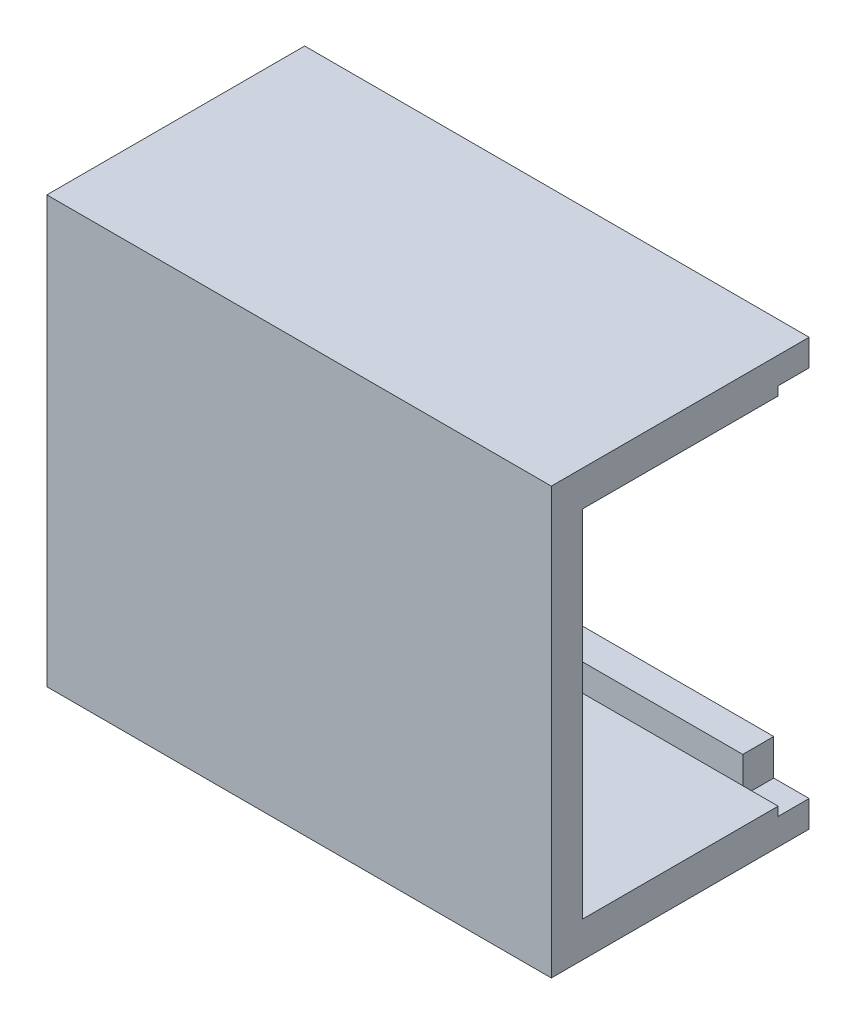
ISO-10303-21;
HEADER;
FILE_DESCRIPTION(('STEP AP214'),'2;1');
FILE_NAME('part.step','',(''),(''),'','','');
FILE_SCHEMA(('AUTOMOTIVE_DESIGN { 1 0 10303 214 1 1 1 1 }'));
ENDSEC;
DATA;
#1=APPLICATION_CONTEXT('core data for automotive mechanical design processes');
#2=APPLICATION_PROTOCOL_DEFINITION('international standard','automotive_design',2000,#1);
#3=PRODUCT_CONTEXT('',#1,'mechanical');
#4=PRODUCT('Part','Part','',(#3));
#5=PRODUCT_RELATED_PRODUCT_CATEGORY('part','',(#4));
#6=PRODUCT_DEFINITION_FORMATION('','',#4);
#7=PRODUCT_DEFINITION_CONTEXT('part definition',#1,'design');
#8=PRODUCT_DEFINITION('design','',#6,#7);
#9=PRODUCT_DEFINITION_SHAPE('','',#8);
#10=(LENGTH_UNIT() NAMED_UNIT(*) SI_UNIT(.MILLI.,.METRE.));
#11=(NAMED_UNIT(*) PLANE_ANGLE_UNIT() SI_UNIT($,.RADIAN.));
#12=(NAMED_UNIT(*) SI_UNIT($,.STERADIAN.) SOLID_ANGLE_UNIT());
#13=UNCERTAINTY_MEASURE_WITH_UNIT(LENGTH_MEASURE(1.E-05),#10,'distance_accuracy_value','');
#14=(GEOMETRIC_REPRESENTATION_CONTEXT(3) GLOBAL_UNCERTAINTY_ASSIGNED_CONTEXT((#13)) GLOBAL_UNIT_ASSIGNED_CONTEXT((#10,
#11,#12)) REPRESENTATION_CONTEXT('',''));
#15=CARTESIAN_POINT('',(0.,0.,0.));
#16=DIRECTION('',(0.,0.,1.));
#17=DIRECTION('',(1.,0.,0.));
#18=AXIS2_PLACEMENT_3D('',#15,#16,#17);
#19=CARTESIAN_POINT('',(0.,0.,0.));
#20=DIRECTION('',(0.,0.,-1.));
#21=DIRECTION('',(-1.,0.,0.));
#22=AXIS2_PLACEMENT_3D('',#19,#20,#21);
#23=PLANE('',#22);
#24=DIRECTION('',(1.,0.,0.));
#25=VECTOR('',#24,1.);
#26=CARTESIAN_POINT('',(12.25,10.5332,0.));
#27=LINE('',#26,#25);
#28=CARTESIAN_POINT('',(12.25,10.5332,0.));
#29=VERTEX_POINT('',#28);
#30=CARTESIAN_POINT('',(14.25,10.5332,0.));
#31=VERTEX_POINT('',#30);
#32=EDGE_CURVE('E207',#29,#31,#27,.T.);
#33=ORIENTED_EDGE('',*,*,#32,.F.);
#34=DIRECTION('',(0.,1.,0.));
#35=VECTOR('',#34,1.);
#36=CARTESIAN_POINT('',(12.25,10.5332,0.));
#37=LINE('',#36,#35);
#38=CARTESIAN_POINT('',(12.25,8.5,0.));
#39=VERTEX_POINT('',#38);
#40=EDGE_CURVE('E224',#39,#29,#37,.T.);
#41=ORIENTED_EDGE('',*,*,#40,.F.);
#42=DIRECTION('',(1.,0.,0.));
#43=VECTOR('',#42,1.);
#44=CARTESIAN_POINT('',(-14.25,8.5,0.));
#45=LINE('',#44,#43);
#46=CARTESIAN_POINT('',(-14.25,8.5,0.));
#47=VERTEX_POINT('',#46);
#48=EDGE_CURVE('E292',#47,#39,#45,.T.);
#49=ORIENTED_EDGE('',*,*,#48,.F.);
#50=DIRECTION('',(0.,1.,0.));
#51=VECTOR('',#50,1.);
#52=CARTESIAN_POINT('',(-14.25,-12.0332,0.));
#53=LINE('',#52,#51);
#54=CARTESIAN_POINT('',(-14.25,12.0332,0.));
#55=VERTEX_POINT('',#54);
#56=EDGE_CURVE('E326',#47,#55,#53,.T.);
#57=ORIENTED_EDGE('',*,*,#56,.T.);
#58=DIRECTION('',(-1.,0.,0.));
#59=VECTOR('',#58,1.);
#60=CARTESIAN_POINT('',(14.25,12.0332,0.));
#61=LINE('',#60,#59);
#62=CARTESIAN_POINT('',(14.25,12.0332,0.));
#63=VERTEX_POINT('',#62);
#64=EDGE_CURVE('E331',#63,#55,#61,.T.);
#65=ORIENTED_EDGE('',*,*,#64,.F.);
#66=DIRECTION('',(0.,1.,0.));
#67=VECTOR('',#66,1.);
#68=CARTESIAN_POINT('',(14.25,-12.0332,0.));
#69=LINE('',#68,#67);
#70=EDGE_CURVE('E335',#31,#63,#69,.T.);
#71=ORIENTED_EDGE('',*,*,#70,.F.);
#72=EDGE_LOOP('',(#33,#41,#49,#57,#65,#71));
#73=FACE_BOUND('',#72,.T.);
#74=ADVANCED_FACE('F45',(#73),#23,.T.);
#75=CARTESIAN_POINT('',(14.25,-12.0332,14.5651));
#76=DIRECTION('',(0.,-1.,0.));
#77=DIRECTION('',(0.,0.,-1.));
#78=AXIS2_PLACEMENT_3D('',#75,#76,#77);
#79=PLANE('',#78);
#80=DIRECTION('',(-1.,0.,0.));
#81=VECTOR('',#80,1.);
#82=CARTESIAN_POINT('',(14.25,-12.0332,0.));
#83=LINE('',#82,#81);
#84=CARTESIAN_POINT('',(14.25,-12.0332,0.));
#85=VERTEX_POINT('',#84);
#86=CARTESIAN_POINT('',(-14.25,-12.0332,0.));
#87=VERTEX_POINT('',#86);
#88=EDGE_CURVE('E280',#85,#87,#83,.T.);
#89=ORIENTED_EDGE('',*,*,#88,.F.);
#90=DIRECTION('',(0.,0.,-1.));
#91=VECTOR('',#90,1.);
#92=CARTESIAN_POINT('',(14.25,-12.0332,14.5651));
#93=LINE('',#92,#91);
#94=CARTESIAN_POINT('',(14.25,-12.0332,14.5651));
#95=VERTEX_POINT('',#94);
#96=EDGE_CURVE('E11',#95,#85,#93,.T.);
#97=ORIENTED_EDGE('',*,*,#96,.F.);
#98=DIRECTION('',(-1.,0.,0.));
#99=VECTOR('',#98,1.);
#100=CARTESIAN_POINT('',(14.25,-12.0332,14.5651));
#101=LINE('',#100,#99);
#102=CARTESIAN_POINT('',(-14.25,-12.0332,14.5651));
#103=VERTEX_POINT('',#102);
#104=EDGE_CURVE('E308',#95,#103,#101,.T.);
#105=ORIENTED_EDGE('',*,*,#104,.T.);
#106=DIRECTION('',(0.,0.,-1.));
#107=VECTOR('',#106,1.);
#108=CARTESIAN_POINT('',(-14.25,-12.0332,14.5651));
#109=LINE('',#108,#107);
#110=EDGE_CURVE('E49',#103,#87,#109,.T.);
#111=ORIENTED_EDGE('',*,*,#110,.T.);
#112=EDGE_LOOP('',(#89,#97,#105,#111));
#113=FACE_BOUND('',#112,.T.);
#114=ADVANCED_FACE('F47',(#113),#79,.T.);
#115=CARTESIAN_POINT('',(14.25,-12.0332,14.5651));
#116=DIRECTION('',(-1.,0.,0.));
#117=DIRECTION('',(0.,0.,1.));
#118=AXIS2_PLACEMENT_3D('',#115,#116,#117);
#119=PLANE('',#118);
#120=CARTESIAN_POINT('',(14.25,-10.5332,0.));
#121=VERTEX_POINT('',#120);
#122=EDGE_CURVE('E313',#85,#121,#69,.T.);
#123=ORIENTED_EDGE('',*,*,#122,.T.);
#124=DIRECTION('',(0.,0.,-1.));
#125=VECTOR('',#124,1.);
#126=CARTESIAN_POINT('',(14.25,-10.5332,0.));
#127=LINE('',#126,#125);
#128=CARTESIAN_POINT('',(14.25,-10.5332,1.75));
#129=VERTEX_POINT('',#128);
#130=EDGE_CURVE('E176',#129,#121,#127,.T.);
#131=ORIENTED_EDGE('',*,*,#130,.F.);
#132=DIRECTION('',(0.,-1.,0.));
#133=VECTOR('',#132,1.);
#134=CARTESIAN_POINT('',(14.25,-10.5332,1.75));
#135=LINE('',#134,#133);
#136=CARTESIAN_POINT('',(14.25,-10.0332,1.75));
#137=VERTEX_POINT('',#136);
#138=EDGE_CURVE('E182',#137,#129,#135,.T.);
#139=ORIENTED_EDGE('',*,*,#138,.F.);
#140=DIRECTION('',(0.,0.,-1.));
#141=VECTOR('',#140,1.);
#142=CARTESIAN_POINT('',(14.25,-10.0332,12.8151));
#143=LINE('',#142,#141);
#144=CARTESIAN_POINT('',(14.25,-10.0332,12.8151));
#145=VERTEX_POINT('',#144);
#146=EDGE_CURVE('E236',#145,#137,#143,.T.);
#147=ORIENTED_EDGE('',*,*,#146,.F.);
#148=DIRECTION('',(0.,-1.,0.));
#149=VECTOR('',#148,1.);
#150=CARTESIAN_POINT('',(14.25,-10.0332,12.8151));
#151=LINE('',#150,#149);
#152=CARTESIAN_POINT('',(14.25,10.0332,12.8151));
#153=VERTEX_POINT('',#152);
#154=EDGE_CURVE('E242',#153,#145,#151,.T.);
#155=ORIENTED_EDGE('',*,*,#154,.F.);
#156=DIRECTION('',(0.,0.,1.));
#157=VECTOR('',#156,1.);
#158=CARTESIAN_POINT('',(14.25,10.0332,12.8151));
#159=LINE('',#158,#157);
#160=CARTESIAN_POINT('',(14.25,10.0332,1.75));
#161=VERTEX_POINT('',#160);
#162=EDGE_CURVE('E270',#161,#153,#159,.T.);
#163=ORIENTED_EDGE('',*,*,#162,.F.);
#164=DIRECTION('',(0.,-1.,0.));
#165=VECTOR('',#164,1.);
#166=CARTESIAN_POINT('',(14.25,10.0332,1.75));
#167=LINE('',#166,#165);
#168=CARTESIAN_POINT('',(14.25,10.5332,1.75));
#169=VERTEX_POINT('',#168);
#170=EDGE_CURVE('E214',#169,#161,#167,.T.);
#171=ORIENTED_EDGE('',*,*,#170,.F.);
#172=DIRECTION('',(0.,0.,1.));
#173=VECTOR('',#172,1.);
#174=CARTESIAN_POINT('',(14.25,10.5332,1.75));
#175=LINE('',#174,#173);
#176=EDGE_CURVE('E201',#31,#169,#175,.T.);
#177=ORIENTED_EDGE('',*,*,#176,.F.);
#178=ORIENTED_EDGE('',*,*,#70,.T.);
#179=DIRECTION('',(0.,0.,-1.));
#180=VECTOR('',#179,1.);
#181=CARTESIAN_POINT('',(14.25,12.0332,14.5651));
#182=LINE('',#181,#180);
#183=CARTESIAN_POINT('',(14.25,12.0332,14.5651));
#184=VERTEX_POINT('',#183);
#185=EDGE_CURVE('E55',#184,#63,#182,.T.);
#186=ORIENTED_EDGE('',*,*,#185,.F.);
#187=DIRECTION('',(0.,1.,0.));
#188=VECTOR('',#187,1.);
#189=CARTESIAN_POINT('',(14.25,-12.0332,14.5651));
#190=LINE('',#189,#188);
#191=EDGE_CURVE('E320',#95,#184,#190,.T.);
#192=ORIENTED_EDGE('',*,*,#191,.F.);
#193=ORIENTED_EDGE('',*,*,#96,.T.);
#194=EDGE_LOOP('',(#123,#131,#139,#147,#155,#163,#171,#177,#178,#186,#192,#193));
#195=FACE_BOUND('',#194,.T.);
#196=ADVANCED_FACE('F359',(#195),#119,.F.);
#197=CARTESIAN_POINT('',(14.25,12.0332,14.5651));
#198=DIRECTION('',(0.,-1.,0.));
#199=DIRECTION('',(0.,0.,-1.));
#200=AXIS2_PLACEMENT_3D('',#197,#198,#199);
#201=PLANE('',#200);
#202=ORIENTED_EDGE('',*,*,#64,.T.);
#203=DIRECTION('',(0.,0.,-1.));
#204=VECTOR('',#203,1.);
#205=CARTESIAN_POINT('',(-14.25,12.0332,14.5651));
#206=LINE('',#205,#204);
#207=CARTESIAN_POINT('',(-14.25,12.0332,14.5651));
#208=VERTEX_POINT('',#207);
#209=EDGE_CURVE('E341',#208,#55,#206,.T.);
#210=ORIENTED_EDGE('',*,*,#209,.F.);
#211=DIRECTION('',(-1.,0.,0.));
#212=VECTOR('',#211,1.);
#213=CARTESIAN_POINT('',(14.25,12.0332,14.5651));
#214=LINE('',#213,#212);
#215=EDGE_CURVE('E317',#184,#208,#214,.T.);
#216=ORIENTED_EDGE('',*,*,#215,.F.);
#217=ORIENTED_EDGE('',*,*,#185,.T.);
#218=EDGE_LOOP('',(#202,#210,#216,#217));
#219=FACE_BOUND('',#218,.T.);
#220=ADVANCED_FACE('F366',(#219),#201,.F.);
#221=CARTESIAN_POINT('',(-14.25,-12.0332,14.5651));
#222=DIRECTION('',(-1.,0.,0.));
#223=DIRECTION('',(0.,0.,1.));
#224=AXIS2_PLACEMENT_3D('',#221,#222,#223);
#225=PLANE('',#224);
#226=DIRECTION('',(0.,0.,1.));
#227=VECTOR('',#226,1.);
#228=CARTESIAN_POINT('',(-14.25,8.5,1.75));
#229=LINE('',#228,#227);
#230=CARTESIAN_POINT('',(-14.25,8.5,1.75));
#231=VERTEX_POINT('',#230);
#232=EDGE_CURVE('E250',#47,#231,#229,.T.);
#233=ORIENTED_EDGE('',*,*,#232,.T.);
#234=DIRECTION('',(0.,1.,0.));
#235=VECTOR('',#234,1.);
#236=CARTESIAN_POINT('',(-14.25,8.5,1.75));
#237=LINE('',#236,#235);
#238=CARTESIAN_POINT('',(-14.25,10.0332,1.75));
#239=VERTEX_POINT('',#238);
#240=EDGE_CURVE('E254',#231,#239,#237,.T.);
#241=ORIENTED_EDGE('',*,*,#240,.T.);
#242=DIRECTION('',(0.,0.,1.));
#243=VECTOR('',#242,1.);
#244=CARTESIAN_POINT('',(-14.25,10.0332,12.8151));
#245=LINE('',#244,#243);
#246=CARTESIAN_POINT('',(-14.25,10.0332,12.8151));
#247=VERTEX_POINT('',#246);
#248=EDGE_CURVE('E258',#239,#247,#245,.T.);
#249=ORIENTED_EDGE('',*,*,#248,.T.);
#250=DIRECTION('',(0.,-1.,0.));
#251=VECTOR('',#250,1.);
#252=CARTESIAN_POINT('',(-14.25,-10.0332,12.8151));
#253=LINE('',#252,#251);
#254=CARTESIAN_POINT('',(-14.25,-10.0332,12.8151));
#255=VERTEX_POINT('',#254);
#256=EDGE_CURVE('E262',#247,#255,#253,.T.);
#257=ORIENTED_EDGE('',*,*,#256,.T.);
#258=DIRECTION('',(0.,0.,-1.));
#259=VECTOR('',#258,1.);
#260=CARTESIAN_POINT('',(-14.25,-10.0332,12.8151));
#261=LINE('',#260,#259);
#262=CARTESIAN_POINT('',(-14.25,-10.0332,1.75));
#263=VERTEX_POINT('',#262);
#264=EDGE_CURVE('E237',#255,#263,#261,.T.);
#265=ORIENTED_EDGE('',*,*,#264,.T.);
#266=DIRECTION('',(0.,1.,0.));
#267=VECTOR('',#266,1.);
#268=CARTESIAN_POINT('',(-14.25,-10.0332,1.75));
#269=LINE('',#268,#267);
#270=CARTESIAN_POINT('',(-14.25,-8.5,1.75));
#271=VERTEX_POINT('',#270);
#272=EDGE_CURVE('E241',#263,#271,#269,.T.);
#273=ORIENTED_EDGE('',*,*,#272,.T.);
#274=DIRECTION('',(0.,0.,-1.));
#275=VECTOR('',#274,1.);
#276=CARTESIAN_POINT('',(-14.25,-8.5,1.75));
#277=LINE('',#276,#275);
#278=CARTESIAN_POINT('',(-14.25,-8.5,0.));
#279=VERTEX_POINT('',#278);
#280=EDGE_CURVE('E246',#271,#279,#277,.T.);
#281=ORIENTED_EDGE('',*,*,#280,.T.);
#282=EDGE_CURVE('E327',#87,#279,#53,.T.);
#283=ORIENTED_EDGE('',*,*,#282,.F.);
#284=ORIENTED_EDGE('',*,*,#110,.F.);
#285=DIRECTION('',(0.,1.,0.));
#286=VECTOR('',#285,1.);
#287=CARTESIAN_POINT('',(-14.25,-12.0332,14.5651));
#288=LINE('',#287,#286);
#289=EDGE_CURVE('E312',#103,#208,#288,.T.);
#290=ORIENTED_EDGE('',*,*,#289,.T.);
#291=ORIENTED_EDGE('',*,*,#209,.T.);
#292=ORIENTED_EDGE('',*,*,#56,.F.);
#293=EDGE_LOOP('',(#233,#241,#249,#257,#265,#273,#281,#283,#284,#290,#291,#292));
#294=FACE_BOUND('',#293,.T.);
#295=ADVANCED_FACE('F353',(#294),#225,.T.);
#296=CARTESIAN_POINT('',(0.,0.,14.5651));
#297=DIRECTION('',(0.,0.,-1.));
#298=DIRECTION('',(-1.,0.,0.));
#299=AXIS2_PLACEMENT_3D('',#296,#297,#298);
#300=PLANE('',#299);
#301=ORIENTED_EDGE('',*,*,#104,.F.);
#302=ORIENTED_EDGE('',*,*,#191,.T.);
#303=ORIENTED_EDGE('',*,*,#215,.T.);
#304=ORIENTED_EDGE('',*,*,#289,.F.);
#305=EDGE_LOOP('',(#301,#302,#303,#304));
#306=FACE_BOUND('',#305,.T.);
#307=ADVANCED_FACE('F364',(#306),#300,.F.);
#308=DIRECTION('',(1.,0.,0.));
#309=VECTOR('',#308,1.);
#310=CARTESIAN_POINT('',(12.25,-10.5332,0.));
#311=LINE('',#310,#309);
#312=CARTESIAN_POINT('',(12.25,-10.5332,0.));
#313=VERTEX_POINT('',#312);
#314=EDGE_CURVE('E186',#313,#121,#311,.T.);
#315=ORIENTED_EDGE('',*,*,#314,.T.);
#316=ORIENTED_EDGE('',*,*,#122,.F.);
#317=ORIENTED_EDGE('',*,*,#88,.T.);
#318=ORIENTED_EDGE('',*,*,#282,.T.);
#319=DIRECTION('',(1.,0.,0.));
#320=VECTOR('',#319,1.);
#321=CARTESIAN_POINT('',(-14.25,-8.5,0.));
#322=LINE('',#321,#320);
#323=CARTESIAN_POINT('',(12.25,-8.5,0.));
#324=VERTEX_POINT('',#323);
#325=EDGE_CURVE('E296',#279,#324,#322,.T.);
#326=ORIENTED_EDGE('',*,*,#325,.T.);
#327=DIRECTION('',(0.,1.,0.));
#328=VECTOR('',#327,1.);
#329=CARTESIAN_POINT('',(12.25,-8.5,0.));
#330=LINE('',#329,#328);
#331=EDGE_CURVE('E191',#313,#324,#330,.T.);
#332=ORIENTED_EDGE('',*,*,#331,.F.);
#333=EDGE_LOOP('',(#315,#316,#317,#318,#326,#332));
#334=FACE_BOUND('',#333,.T.);
#335=ADVANCED_FACE('F357',(#334),#23,.T.);
#336=CARTESIAN_POINT('',(-14.25,-10.0332,12.8151));
#337=DIRECTION('',(0.,-1.,0.));
#338=DIRECTION('',(0.,0.,-1.));
#339=AXIS2_PLACEMENT_3D('',#336,#337,#338);
#340=PLANE('',#339);
#341=ORIENTED_EDGE('',*,*,#146,.T.);
#342=DIRECTION('',(1.,0.,0.));
#343=VECTOR('',#342,1.);
#344=CARTESIAN_POINT('',(-14.25,-10.0332,1.75));
#345=LINE('',#344,#343);
#346=CARTESIAN_POINT('',(12.25,-10.0332,1.75));
#347=VERTEX_POINT('',#346);
#348=EDGE_CURVE('E266',#347,#137,#345,.T.);
#349=ORIENTED_EDGE('',*,*,#348,.F.);
#350=EDGE_CURVE('E304',#263,#347,#345,.T.);
#351=ORIENTED_EDGE('',*,*,#350,.F.);
#352=ORIENTED_EDGE('',*,*,#264,.F.);
#353=DIRECTION('',(1.,0.,0.));
#354=VECTOR('',#353,1.);
#355=CARTESIAN_POINT('',(-14.25,-10.0332,12.8151));
#356=LINE('',#355,#354);
#357=EDGE_CURVE('E277',#255,#145,#356,.T.);
#358=ORIENTED_EDGE('',*,*,#357,.T.);
#359=EDGE_LOOP('',(#341,#349,#351,#352,#358));
#360=FACE_BOUND('',#359,.T.);
#361=ADVANCED_FACE('F378',(#360),#340,.F.);
#362=CARTESIAN_POINT('',(-14.25,-10.0332,12.8151));
#363=DIRECTION('',(0.,0.,1.));
#364=DIRECTION('',(1.,0.,0.));
#365=AXIS2_PLACEMENT_3D('',#362,#363,#364);
#366=PLANE('',#365);
#367=ORIENTED_EDGE('',*,*,#154,.T.);
#368=ORIENTED_EDGE('',*,*,#357,.F.);
#369=ORIENTED_EDGE('',*,*,#256,.F.);
#370=DIRECTION('',(1.,0.,0.));
#371=VECTOR('',#370,1.);
#372=CARTESIAN_POINT('',(-14.25,10.0332,12.8151));
#373=LINE('',#372,#371);
#374=EDGE_CURVE('E281',#247,#153,#373,.T.);
#375=ORIENTED_EDGE('',*,*,#374,.T.);
#376=EDGE_LOOP('',(#367,#368,#369,#375));
#377=FACE_BOUND('',#376,.T.);
#378=ADVANCED_FACE('F382',(#377),#366,.F.);
#379=CARTESIAN_POINT('',(-14.25,10.0332,12.8151));
#380=DIRECTION('',(0.,1.,0.));
#381=DIRECTION('',(0.,0.,1.));
#382=AXIS2_PLACEMENT_3D('',#379,#380,#381);
#383=PLANE('',#382);
#384=ORIENTED_EDGE('',*,*,#162,.T.);
#385=ORIENTED_EDGE('',*,*,#374,.F.);
#386=ORIENTED_EDGE('',*,*,#248,.F.);
#387=DIRECTION('',(1.,0.,0.));
#388=VECTOR('',#387,1.);
#389=CARTESIAN_POINT('',(-14.25,10.0332,1.75));
#390=LINE('',#389,#388);
#391=CARTESIAN_POINT('',(12.25,10.0332,1.75));
#392=VERTEX_POINT('',#391);
#393=EDGE_CURVE('E284',#239,#392,#390,.T.);
#394=ORIENTED_EDGE('',*,*,#393,.T.);
#395=DIRECTION('',(1.,0.,0.));
#396=VECTOR('',#395,1.);
#397=CARTESIAN_POINT('',(-14.25,10.0332,1.75));
#398=LINE('',#397,#396);
#399=EDGE_CURVE('E205',#392,#161,#398,.T.);
#400=ORIENTED_EDGE('',*,*,#399,.T.);
#401=EDGE_LOOP('',(#384,#385,#386,#394,#400));
#402=FACE_BOUND('',#401,.T.);
#403=ADVANCED_FACE('F387',(#402),#383,.F.);
#404=CARTESIAN_POINT('',(-14.25,8.5,1.75));
#405=DIRECTION('',(0.,0.,-1.));
#406=DIRECTION('',(-1.,0.,0.));
#407=AXIS2_PLACEMENT_3D('',#404,#405,#406);
#408=PLANE('',#407);
#409=DIRECTION('',(1.,0.,0.));
#410=VECTOR('',#409,1.);
#411=CARTESIAN_POINT('',(-14.25,8.5,1.75));
#412=LINE('',#411,#410);
#413=CARTESIAN_POINT('',(12.25,8.5,1.75));
#414=VERTEX_POINT('',#413);
#415=EDGE_CURVE('E288',#231,#414,#412,.T.);
#416=ORIENTED_EDGE('',*,*,#415,.T.);
#417=DIRECTION('',(0.,-1.,0.));
#418=VECTOR('',#417,1.);
#419=CARTESIAN_POINT('',(12.25,8.5,1.75));
#420=LINE('',#419,#418);
#421=EDGE_CURVE('E63',#392,#414,#420,.T.);
#422=ORIENTED_EDGE('',*,*,#421,.F.);
#423=ORIENTED_EDGE('',*,*,#393,.F.);
#424=ORIENTED_EDGE('',*,*,#240,.F.);
#425=EDGE_LOOP('',(#416,#422,#423,#424));
#426=FACE_BOUND('',#425,.T.);
#427=ADVANCED_FACE('F394',(#426),#408,.F.);
#428=CARTESIAN_POINT('',(-14.25,8.5,1.75));
#429=DIRECTION('',(0.,1.,0.));
#430=DIRECTION('',(0.,0.,1.));
#431=AXIS2_PLACEMENT_3D('',#428,#429,#430);
#432=PLANE('',#431);
#433=ORIENTED_EDGE('',*,*,#48,.T.);
#434=DIRECTION('',(0.,0.,-1.));
#435=VECTOR('',#434,1.);
#436=CARTESIAN_POINT('',(12.25,8.5,0.));
#437=LINE('',#436,#435);
#438=EDGE_CURVE('E228',#414,#39,#437,.T.);
#439=ORIENTED_EDGE('',*,*,#438,.F.);
#440=ORIENTED_EDGE('',*,*,#415,.F.);
#441=ORIENTED_EDGE('',*,*,#232,.F.);
#442=EDGE_LOOP('',(#433,#439,#440,#441));
#443=FACE_BOUND('',#442,.T.);
#444=ADVANCED_FACE('F398',(#443),#432,.F.);
#445=CARTESIAN_POINT('',(-14.25,-8.5,1.75));
#446=DIRECTION('',(0.,-1.,0.));
#447=DIRECTION('',(0.,0.,-1.));
#448=AXIS2_PLACEMENT_3D('',#445,#446,#447);
#449=PLANE('',#448);
#450=DIRECTION('',(1.,0.,0.));
#451=VECTOR('',#450,1.);
#452=CARTESIAN_POINT('',(-14.25,-8.5,1.75));
#453=LINE('',#452,#451);
#454=CARTESIAN_POINT('',(12.25,-8.5,1.75));
#455=VERTEX_POINT('',#454);
#456=EDGE_CURVE('E300',#271,#455,#453,.T.);
#457=ORIENTED_EDGE('',*,*,#456,.T.);
#458=DIRECTION('',(0.,0.,1.));
#459=VECTOR('',#458,1.);
#460=CARTESIAN_POINT('',(12.25,-8.5,1.75));
#461=LINE('',#460,#459);
#462=EDGE_CURVE('E71',#324,#455,#461,.T.);
#463=ORIENTED_EDGE('',*,*,#462,.F.);
#464=ORIENTED_EDGE('',*,*,#325,.F.);
#465=ORIENTED_EDGE('',*,*,#280,.F.);
#466=EDGE_LOOP('',(#457,#463,#464,#465));
#467=FACE_BOUND('',#466,.T.);
#468=ADVANCED_FACE('F434',(#467),#449,.F.);
#469=CARTESIAN_POINT('',(-14.25,-10.0332,1.75));
#470=DIRECTION('',(0.,0.,-1.));
#471=DIRECTION('',(-1.,0.,0.));
#472=AXIS2_PLACEMENT_3D('',#469,#470,#471);
#473=PLANE('',#472);
#474=ORIENTED_EDGE('',*,*,#350,.T.);
#475=DIRECTION('',(0.,-1.,0.));
#476=VECTOR('',#475,1.);
#477=CARTESIAN_POINT('',(12.25,-10.0332,1.75));
#478=LINE('',#477,#476);
#479=EDGE_CURVE('E172',#455,#347,#478,.T.);
#480=ORIENTED_EDGE('',*,*,#479,.F.);
#481=ORIENTED_EDGE('',*,*,#456,.F.);
#482=ORIENTED_EDGE('',*,*,#272,.F.);
#483=EDGE_LOOP('',(#474,#480,#481,#482));
#484=FACE_BOUND('',#483,.T.);
#485=ADVANCED_FACE('F431',(#484),#473,.F.);
#486=CARTESIAN_POINT('',(12.25,-10.5332,1.75));
#487=DIRECTION('',(0.,0.,1.));
#488=DIRECTION('',(1.,0.,0.));
#489=AXIS2_PLACEMENT_3D('',#486,#487,#488);
#490=PLANE('',#489);
#491=ORIENTED_EDGE('',*,*,#138,.T.);
#492=DIRECTION('',(1.,0.,0.));
#493=VECTOR('',#492,1.);
#494=CARTESIAN_POINT('',(12.25,-10.5332,1.75));
#495=LINE('',#494,#493);
#496=CARTESIAN_POINT('',(12.25,-10.5332,1.75));
#497=VERTEX_POINT('',#496);
#498=EDGE_CURVE('E179',#497,#129,#495,.T.);
#499=ORIENTED_EDGE('',*,*,#498,.F.);
#500=EDGE_CURVE('E166',#347,#497,#478,.T.);
#501=ORIENTED_EDGE('',*,*,#500,.F.);
#502=ORIENTED_EDGE('',*,*,#348,.T.);
#503=EDGE_LOOP('',(#491,#499,#501,#502));
#504=FACE_BOUND('',#503,.T.);
#505=ADVANCED_FACE('F180',(#504),#490,.F.);
#506=CARTESIAN_POINT('',(12.25,-10.5332,0.));
#507=DIRECTION('',(0.,-1.,0.));
#508=DIRECTION('',(0.,0.,-1.));
#509=AXIS2_PLACEMENT_3D('',#506,#507,#508);
#510=PLANE('',#509);
#511=ORIENTED_EDGE('',*,*,#130,.T.);
#512=ORIENTED_EDGE('',*,*,#314,.F.);
#513=DIRECTION('',(0.,0.,-1.));
#514=VECTOR('',#513,1.);
#515=CARTESIAN_POINT('',(12.25,-10.5332,0.));
#516=LINE('',#515,#514);
#517=EDGE_CURVE('E170',#497,#313,#516,.T.);
#518=ORIENTED_EDGE('',*,*,#517,.F.);
#519=ORIENTED_EDGE('',*,*,#498,.T.);
#520=EDGE_LOOP('',(#511,#512,#518,#519));
#521=FACE_BOUND('',#520,.T.);
#522=ADVANCED_FACE('F188',(#521),#510,.F.);
#523=CARTESIAN_POINT('',(12.25,0.,0.));
#524=DIRECTION('',(-1.,0.,0.));
#525=DIRECTION('',(0.,0.,1.));
#526=AXIS2_PLACEMENT_3D('',#523,#524,#525);
#527=PLANE('',#526);
#528=ORIENTED_EDGE('',*,*,#479,.T.);
#529=ORIENTED_EDGE('',*,*,#500,.T.);
#530=ORIENTED_EDGE('',*,*,#517,.T.);
#531=ORIENTED_EDGE('',*,*,#331,.T.);
#532=ORIENTED_EDGE('',*,*,#462,.T.);
#533=EDGE_LOOP('',(#528,#529,#530,#531,#532));
#534=FACE_BOUND('',#533,.T.);
#535=ADVANCED_FACE('F168',(#534),#527,.F.);
#536=CARTESIAN_POINT('',(12.25,10.0332,1.75));
#537=DIRECTION('',(0.,0.,1.));
#538=DIRECTION('',(1.,0.,0.));
#539=AXIS2_PLACEMENT_3D('',#536,#537,#538);
#540=PLANE('',#539);
#541=CARTESIAN_POINT('',(12.25,10.5332,1.75));
#542=VERTEX_POINT('',#541);
#543=EDGE_CURVE('E217',#542,#392,#420,.T.);
#544=ORIENTED_EDGE('',*,*,#543,.F.);
#545=DIRECTION('',(1.,0.,0.));
#546=VECTOR('',#545,1.);
#547=CARTESIAN_POINT('',(12.25,10.5332,1.75));
#548=LINE('',#547,#546);
#549=EDGE_CURVE('E211',#542,#169,#548,.T.);
#550=ORIENTED_EDGE('',*,*,#549,.T.);
#551=ORIENTED_EDGE('',*,*,#170,.T.);
#552=ORIENTED_EDGE('',*,*,#399,.F.);
#553=EDGE_LOOP('',(#544,#550,#551,#552));
#554=FACE_BOUND('',#553,.T.);
#555=ADVANCED_FACE('F390',(#554),#540,.F.);
#556=CARTESIAN_POINT('',(12.25,10.5332,1.75));
#557=DIRECTION('',(0.,1.,0.));
#558=DIRECTION('',(0.,0.,1.));
#559=AXIS2_PLACEMENT_3D('',#556,#557,#558);
#560=PLANE('',#559);
#561=ORIENTED_EDGE('',*,*,#176,.T.);
#562=ORIENTED_EDGE('',*,*,#549,.F.);
#563=DIRECTION('',(0.,0.,1.));
#564=VECTOR('',#563,1.);
#565=CARTESIAN_POINT('',(12.25,10.5332,1.75));
#566=LINE('',#565,#564);
#567=EDGE_CURVE('E210',#29,#542,#566,.T.);
#568=ORIENTED_EDGE('',*,*,#567,.F.);
#569=ORIENTED_EDGE('',*,*,#32,.T.);
#570=EDGE_LOOP('',(#561,#562,#568,#569));
#571=FACE_BOUND('',#570,.T.);
#572=ADVANCED_FACE('F400',(#571),#560,.F.);
#573=CARTESIAN_POINT('',(12.25,0.,0.));
#574=DIRECTION('',(-1.,0.,0.));
#575=DIRECTION('',(0.,0.,1.));
#576=AXIS2_PLACEMENT_3D('',#573,#574,#575);
#577=PLANE('',#576);
#578=ORIENTED_EDGE('',*,*,#543,.T.);
#579=ORIENTED_EDGE('',*,*,#421,.T.);
#580=ORIENTED_EDGE('',*,*,#438,.T.);
#581=ORIENTED_EDGE('',*,*,#40,.T.);
#582=ORIENTED_EDGE('',*,*,#567,.T.);
#583=EDGE_LOOP('',(#578,#579,#580,#581,#582));
#584=FACE_BOUND('',#583,.T.);
#585=ADVANCED_FACE('F392',(#584),#577,.F.);
#586=CLOSED_SHELL('',(#74,#114,#196,#220,#295,#307,#335,#361,#378,#403,#427,#444,#468,#485,#505,
#522,#535,#555,#572,#585));
#587=MANIFOLD_SOLID_BREP('B2',#586);
#588=ADVANCED_BREP_SHAPE_REPRESENTATION('',(#18,#587),#14);
#589=SHAPE_DEFINITION_REPRESENTATION(#9,#588);
ENDSEC;
END-ISO-10303-21;
